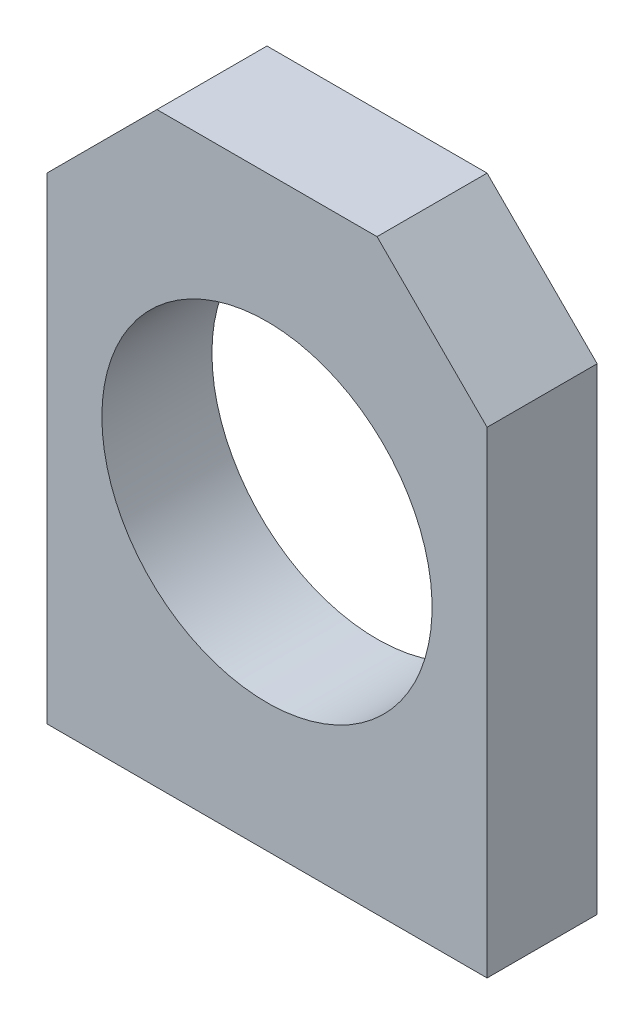
ISO-10303-21;
HEADER;
FILE_DESCRIPTION(('STEP AP214'),'2;1');
FILE_NAME('part.step','',(''),(''),'','','');
FILE_SCHEMA(('AUTOMOTIVE_DESIGN { 1 0 10303 214 1 1 1 1 }'));
ENDSEC;
DATA;
#1=APPLICATION_CONTEXT('core data for automotive mechanical design processes');
#2=APPLICATION_PROTOCOL_DEFINITION('international standard','automotive_design',2000,#1);
#3=PRODUCT_CONTEXT('',#1,'mechanical');
#4=PRODUCT('Part','Part','',(#3));
#5=PRODUCT_RELATED_PRODUCT_CATEGORY('part','',(#4));
#6=PRODUCT_DEFINITION_FORMATION('','',#4);
#7=PRODUCT_DEFINITION_CONTEXT('part definition',#1,'design');
#8=PRODUCT_DEFINITION('design','',#6,#7);
#9=PRODUCT_DEFINITION_SHAPE('','',#8);
#10=(LENGTH_UNIT() NAMED_UNIT(*) SI_UNIT(.MILLI.,.METRE.));
#11=(NAMED_UNIT(*) PLANE_ANGLE_UNIT() SI_UNIT($,.RADIAN.));
#12=(NAMED_UNIT(*) SI_UNIT($,.STERADIAN.) SOLID_ANGLE_UNIT());
#13=UNCERTAINTY_MEASURE_WITH_UNIT(LENGTH_MEASURE(1.E-05),#10,'distance_accuracy_value','');
#14=(GEOMETRIC_REPRESENTATION_CONTEXT(3) GLOBAL_UNCERTAINTY_ASSIGNED_CONTEXT((#13)) GLOBAL_UNIT_ASSIGNED_CONTEXT((#10,
#11,#12)) REPRESENTATION_CONTEXT('',''));
#15=CARTESIAN_POINT('',(0.,0.,0.));
#16=DIRECTION('',(0.,0.,1.));
#17=DIRECTION('',(1.,0.,0.));
#18=AXIS2_PLACEMENT_3D('',#15,#16,#17);
#19=CARTESIAN_POINT('',(-19.05,25.4,0.));
#20=DIRECTION('',(1.,0.,0.));
#21=DIRECTION('',(0.,0.,-1.));
#22=AXIS2_PLACEMENT_3D('',#19,#20,#21);
#23=PLANE('',#22);
#24=DIRECTION('',(0.,-1.,0.));
#25=VECTOR('',#24,1.);
#26=CARTESIAN_POINT('',(-19.05,25.4,9.52500000000001));
#27=LINE('',#26,#25);
#28=CARTESIAN_POINT('',(-19.05,15.8750000000001,9.52500000000001));
#29=VERTEX_POINT('',#28);
#30=CARTESIAN_POINT('',(-19.05,-25.4,9.52500000000001));
#31=VERTEX_POINT('',#30);
#32=EDGE_CURVE('E11',#29,#31,#27,.T.);
#33=ORIENTED_EDGE('',*,*,#32,.F.);
#34=DIRECTION('',(0.,0.,-1.));
#35=VECTOR('',#34,1.);
#36=CARTESIAN_POINT('',(-19.05,15.8750000000001,9.52500000000001));
#37=LINE('',#36,#35);
#38=CARTESIAN_POINT('',(-19.05,15.8750000000001,0.));
#39=VERTEX_POINT('',#38);
#40=EDGE_CURVE('E137',#29,#39,#37,.T.);
#41=ORIENTED_EDGE('',*,*,#40,.T.);
#42=DIRECTION('',(0.,-1.,0.));
#43=VECTOR('',#42,1.);
#44=CARTESIAN_POINT('',(-19.05,25.4,0.));
#45=LINE('',#44,#43);
#46=CARTESIAN_POINT('',(-19.05,-25.4,0.));
#47=VERTEX_POINT('',#46);
#48=EDGE_CURVE('E111',#39,#47,#45,.T.);
#49=ORIENTED_EDGE('',*,*,#48,.T.);
#50=DIRECTION('',(0.,0.,1.));
#51=VECTOR('',#50,1.);
#52=CARTESIAN_POINT('',(-19.05,-25.4,0.));
#53=LINE('',#52,#51);
#54=EDGE_CURVE('E123',#47,#31,#53,.T.);
#55=ORIENTED_EDGE('',*,*,#54,.T.);
#56=EDGE_LOOP('',(#33,#41,#49,#55));
#57=FACE_BOUND('',#56,.T.);
#58=ADVANCED_FACE('F41',(#57),#23,.F.);
#59=CARTESIAN_POINT('',(-19.05,25.4,9.52500000000001));
#60=DIRECTION('',(0.,0.,-1.));
#61=DIRECTION('',(-1.,0.,0.));
#62=AXIS2_PLACEMENT_3D('',#59,#60,#61);
#63=PLANE('',#62);
#64=CARTESIAN_POINT('',(0.,0.,9.52500000000001));
#65=DIRECTION('',(0.,0.,-1.));
#66=DIRECTION('',(-1.,0.,0.));
#67=AXIS2_PLACEMENT_3D('',#64,#65,#66);
#68=CIRCLE('',#67,14.2875);
#69=CARTESIAN_POINT('',(-14.2875,0.,9.52500000000001));
#70=VERTEX_POINT('',#69);
#71=EDGE_CURVE('E126',#70,#70,#68,.T.);
#72=ORIENTED_EDGE('',*,*,#71,.T.);
#73=EDGE_LOOP('',(#72));
#74=FACE_BOUND('',#73,.T.);
#75=DIRECTION('',(0.,-1.,0.));
#76=VECTOR('',#75,1.);
#77=CARTESIAN_POINT('',(19.05,25.4,9.525));
#78=LINE('',#77,#76);
#79=CARTESIAN_POINT('',(19.05,15.8750000000001,9.52500000000001));
#80=VERTEX_POINT('',#79);
#81=CARTESIAN_POINT('',(19.05,-25.4,9.525));
#82=VERTEX_POINT('',#81);
#83=EDGE_CURVE('E48',#80,#82,#78,.T.);
#84=ORIENTED_EDGE('',*,*,#83,.F.);
#85=DIRECTION('',(-0.707106781186551,0.707106781186544,0.));
#86=VECTOR('',#85,1.);
#87=CARTESIAN_POINT('',(9.525,25.4,9.52500000000001));
#88=LINE('',#87,#86);
#89=CARTESIAN_POINT('',(9.525,25.4,9.52500000000001));
#90=VERTEX_POINT('',#89);
#91=EDGE_CURVE('E90',#80,#90,#88,.T.);
#92=ORIENTED_EDGE('',*,*,#91,.T.);
#93=DIRECTION('',(1.,0.,0.));
#94=VECTOR('',#93,1.);
#95=CARTESIAN_POINT('',(-19.05,25.4,9.52500000000001));
#96=LINE('',#95,#94);
#97=CARTESIAN_POINT('',(-9.525,25.4,9.525));
#98=VERTEX_POINT('',#97);
#99=EDGE_CURVE('E119',#98,#90,#96,.T.);
#100=ORIENTED_EDGE('',*,*,#99,.F.);
#101=DIRECTION('',(-0.707106781186551,-0.707106781186544,0.));
#102=VECTOR('',#101,1.);
#103=CARTESIAN_POINT('',(-19.05,15.8750000000001,9.52500000000001));
#104=LINE('',#103,#102);
#105=EDGE_CURVE('E63',#98,#29,#104,.T.);
#106=ORIENTED_EDGE('',*,*,#105,.T.);
#107=ORIENTED_EDGE('',*,*,#32,.T.);
#108=DIRECTION('',(1.,0.,0.));
#109=VECTOR('',#108,1.);
#110=CARTESIAN_POINT('',(-19.05,-25.4,9.52500000000001));
#111=LINE('',#110,#109);
#112=EDGE_CURVE('E109',#31,#82,#111,.T.);
#113=ORIENTED_EDGE('',*,*,#112,.T.);
#114=EDGE_LOOP('',(#84,#92,#100,#106,#107,#113));
#115=FACE_BOUND('',#114,.T.);
#116=ADVANCED_FACE('F107',(#74,#115),#63,.F.);
#117=CARTESIAN_POINT('',(19.05,25.4,9.525));
#118=DIRECTION('',(-1.,0.,0.));
#119=DIRECTION('',(0.,0.,1.));
#120=AXIS2_PLACEMENT_3D('',#117,#118,#119);
#121=PLANE('',#120);
#122=DIRECTION('',(0.,-1.,0.));
#123=VECTOR('',#122,1.);
#124=CARTESIAN_POINT('',(19.05,25.4,0.));
#125=LINE('',#124,#123);
#126=CARTESIAN_POINT('',(19.05,15.8750000000001,0.));
#127=VERTEX_POINT('',#126);
#128=CARTESIAN_POINT('',(19.05,-25.4,0.));
#129=VERTEX_POINT('',#128);
#130=EDGE_CURVE('E105',#127,#129,#125,.T.);
#131=ORIENTED_EDGE('',*,*,#130,.F.);
#132=DIRECTION('',(0.,0.,-1.));
#133=VECTOR('',#132,1.);
#134=CARTESIAN_POINT('',(19.05,15.8750000000001,9.52500000000001));
#135=LINE('',#134,#133);
#136=EDGE_CURVE('E93',#80,#127,#135,.T.);
#137=ORIENTED_EDGE('',*,*,#136,.F.);
#138=ORIENTED_EDGE('',*,*,#83,.T.);
#139=DIRECTION('',(0.,0.,-1.));
#140=VECTOR('',#139,1.);
#141=CARTESIAN_POINT('',(19.05,-25.4,9.525));
#142=LINE('',#141,#140);
#143=EDGE_CURVE('E120',#82,#129,#142,.T.);
#144=ORIENTED_EDGE('',*,*,#143,.T.);
#145=EDGE_LOOP('',(#131,#137,#138,#144));
#146=FACE_BOUND('',#145,.T.);
#147=ADVANCED_FACE('F102',(#146),#121,.F.);
#148=CARTESIAN_POINT('',(19.05,25.4,0.));
#149=DIRECTION('',(0.,0.,1.));
#150=DIRECTION('',(1.,0.,0.));
#151=AXIS2_PLACEMENT_3D('',#148,#149,#150);
#152=PLANE('',#151);
#153=CARTESIAN_POINT('',(0.,0.,0.));
#154=DIRECTION('',(0.,0.,-1.));
#155=DIRECTION('',(-1.,0.,0.));
#156=AXIS2_PLACEMENT_3D('',#153,#154,#155);
#157=CIRCLE('',#156,14.2875);
#158=CARTESIAN_POINT('',(-14.2875,0.,0.));
#159=VERTEX_POINT('',#158);
#160=EDGE_CURVE('E130',#159,#159,#157,.T.);
#161=ORIENTED_EDGE('',*,*,#160,.F.);
#162=EDGE_LOOP('',(#161));
#163=FACE_BOUND('',#162,.T.);
#164=DIRECTION('',(-1.,0.,0.));
#165=VECTOR('',#164,1.);
#166=CARTESIAN_POINT('',(19.05,25.4,0.));
#167=LINE('',#166,#165);
#168=CARTESIAN_POINT('',(9.525,25.4,0.));
#169=VERTEX_POINT('',#168);
#170=CARTESIAN_POINT('',(-9.525,25.4,0.));
#171=VERTEX_POINT('',#170);
#172=EDGE_CURVE('E115',#169,#171,#167,.T.);
#173=ORIENTED_EDGE('',*,*,#172,.F.);
#174=DIRECTION('',(-0.707106781186551,0.707106781186544,0.));
#175=VECTOR('',#174,1.);
#176=CARTESIAN_POINT('',(9.525,25.4,0.));
#177=LINE('',#176,#175);
#178=EDGE_CURVE('E55',#127,#169,#177,.T.);
#179=ORIENTED_EDGE('',*,*,#178,.F.);
#180=ORIENTED_EDGE('',*,*,#130,.T.);
#181=DIRECTION('',(-1.,0.,0.));
#182=VECTOR('',#181,1.);
#183=CARTESIAN_POINT('',(19.05,-25.4,0.));
#184=LINE('',#183,#182);
#185=EDGE_CURVE('E116',#129,#47,#184,.T.);
#186=ORIENTED_EDGE('',*,*,#185,.T.);
#187=ORIENTED_EDGE('',*,*,#48,.F.);
#188=DIRECTION('',(-0.707106781186551,-0.707106781186544,0.));
#189=VECTOR('',#188,1.);
#190=CARTESIAN_POINT('',(-19.05,15.8750000000001,0.));
#191=LINE('',#190,#189);
#192=EDGE_CURVE('E136',#171,#39,#191,.T.);
#193=ORIENTED_EDGE('',*,*,#192,.F.);
#194=EDGE_LOOP('',(#173,#179,#180,#186,#187,#193));
#195=FACE_BOUND('',#194,.T.);
#196=ADVANCED_FACE('F149',(#163,#195),#152,.F.);
#197=CARTESIAN_POINT('',(0.,25.4,0.));
#198=DIRECTION('',(0.,1.,0.));
#199=DIRECTION('',(0.,0.,1.));
#200=AXIS2_PLACEMENT_3D('',#197,#198,#199);
#201=PLANE('',#200);
#202=DIRECTION('',(0.,0.,-1.));
#203=VECTOR('',#202,1.);
#204=CARTESIAN_POINT('',(9.525,25.4,9.52500000000001));
#205=LINE('',#204,#203);
#206=EDGE_CURVE('E94',#90,#169,#205,.T.);
#207=ORIENTED_EDGE('',*,*,#206,.T.);
#208=ORIENTED_EDGE('',*,*,#172,.T.);
#209=DIRECTION('',(0.,0.,-1.));
#210=VECTOR('',#209,1.);
#211=CARTESIAN_POINT('',(-9.525,25.4,9.52500000000001));
#212=LINE('',#211,#210);
#213=EDGE_CURVE('E139',#98,#171,#212,.T.);
#214=ORIENTED_EDGE('',*,*,#213,.F.);
#215=ORIENTED_EDGE('',*,*,#99,.T.);
#216=EDGE_LOOP('',(#207,#208,#214,#215));
#217=FACE_BOUND('',#216,.T.);
#218=ADVANCED_FACE('F146',(#217),#201,.T.);
#219=CARTESIAN_POINT('',(0.,-25.4,0.));
#220=DIRECTION('',(0.,1.,0.));
#221=DIRECTION('',(0.,0.,1.));
#222=AXIS2_PLACEMENT_3D('',#219,#220,#221);
#223=PLANE('',#222);
#224=ORIENTED_EDGE('',*,*,#54,.F.);
#225=ORIENTED_EDGE('',*,*,#185,.F.);
#226=ORIENTED_EDGE('',*,*,#143,.F.);
#227=ORIENTED_EDGE('',*,*,#112,.F.);
#228=EDGE_LOOP('',(#224,#225,#226,#227));
#229=FACE_BOUND('',#228,.T.);
#230=ADVANCED_FACE('F156',(#229),#223,.F.);
#231=CARTESIAN_POINT('',(0.,0.,9.52500000000001));
#232=DIRECTION('',(0.,0.,-1.));
#233=DIRECTION('',(-1.,0.,0.));
#234=AXIS2_PLACEMENT_3D('',#231,#232,#233);
#235=CYLINDRICAL_SURFACE('',#234,14.2875);
#236=ORIENTED_EDGE('',*,*,#71,.F.);
#237=EDGE_LOOP('',(#236));
#238=FACE_BOUND('',#237,.T.);
#239=ORIENTED_EDGE('',*,*,#160,.T.);
#240=EDGE_LOOP('',(#239));
#241=FACE_BOUND('',#240,.T.);
#242=ADVANCED_FACE('F159',(#238,#241),#235,.F.);
#243=CARTESIAN_POINT('',(-19.05,15.8750000000001,9.52500000000001));
#244=DIRECTION('',(0.707106781186544,-0.707106781186551,0.));
#245=DIRECTION('',(0.707106781186551,0.707106781186544,0.));
#246=AXIS2_PLACEMENT_3D('',#243,#244,#245);
#247=PLANE('',#246);
#248=ORIENTED_EDGE('',*,*,#192,.T.);
#249=ORIENTED_EDGE('',*,*,#40,.F.);
#250=ORIENTED_EDGE('',*,*,#105,.F.);
#251=ORIENTED_EDGE('',*,*,#213,.T.);
#252=EDGE_LOOP('',(#248,#249,#250,#251));
#253=FACE_BOUND('',#252,.T.);
#254=ADVANCED_FACE('F151',(#253),#247,.F.);
#255=CARTESIAN_POINT('',(9.525,25.4,9.52500000000001));
#256=DIRECTION('',(-0.707106781186544,-0.707106781186551,0.));
#257=DIRECTION('',(0.707106781186551,-0.707106781186544,0.));
#258=AXIS2_PLACEMENT_3D('',#255,#256,#257);
#259=PLANE('',#258);
#260=ORIENTED_EDGE('',*,*,#178,.T.);
#261=ORIENTED_EDGE('',*,*,#206,.F.);
#262=ORIENTED_EDGE('',*,*,#91,.F.);
#263=ORIENTED_EDGE('',*,*,#136,.T.);
#264=EDGE_LOOP('',(#260,#261,#262,#263));
#265=FACE_BOUND('',#264,.T.);
#266=ADVANCED_FACE('F92',(#265),#259,.F.);
#267=CLOSED_SHELL('',(#58,#116,#147,#196,#218,#230,#242,#254,#266));
#268=MANIFOLD_SOLID_BREP('B2',#267);
#269=ADVANCED_BREP_SHAPE_REPRESENTATION('',(#18,#268),#14);
#270=SHAPE_DEFINITION_REPRESENTATION(#9,#269);
ENDSEC;
END-ISO-10303-21;
